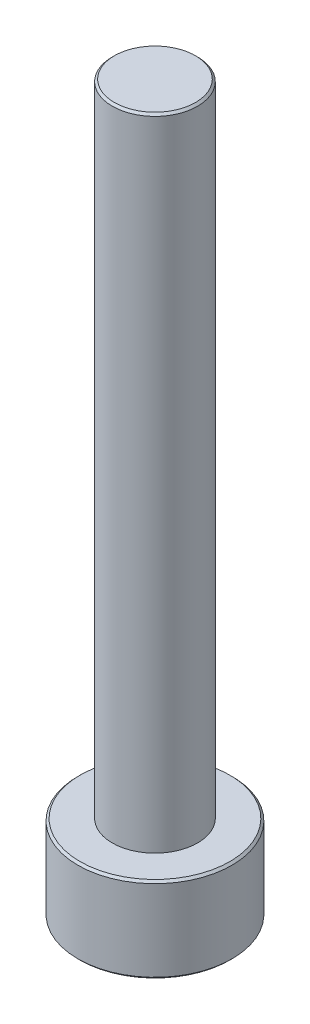
ISO-10303-21;
HEADER;
FILE_DESCRIPTION(('STEP AP214'),'2;1');
FILE_NAME('part.step','',(''),(''),'','','');
FILE_SCHEMA(('AUTOMOTIVE_DESIGN { 1 0 10303 214 1 1 1 1 }'));
ENDSEC;
DATA;
#1=APPLICATION_CONTEXT('core data for automotive mechanical design processes');
#2=APPLICATION_PROTOCOL_DEFINITION('international standard','automotive_design',2000,#1);
#3=PRODUCT_CONTEXT('',#1,'mechanical');
#4=PRODUCT('Part','Part','',(#3));
#5=PRODUCT_RELATED_PRODUCT_CATEGORY('part','',(#4));
#6=PRODUCT_DEFINITION_FORMATION('','',#4);
#7=PRODUCT_DEFINITION_CONTEXT('part definition',#1,'design');
#8=PRODUCT_DEFINITION('design','',#6,#7);
#9=PRODUCT_DEFINITION_SHAPE('','',#8);
#10=(LENGTH_UNIT() NAMED_UNIT(*) SI_UNIT(.MILLI.,.METRE.));
#11=(NAMED_UNIT(*) PLANE_ANGLE_UNIT() SI_UNIT($,.RADIAN.));
#12=(NAMED_UNIT(*) SI_UNIT($,.STERADIAN.) SOLID_ANGLE_UNIT());
#13=UNCERTAINTY_MEASURE_WITH_UNIT(LENGTH_MEASURE(1.E-05),#10,'distance_accuracy_value','');
#14=(GEOMETRIC_REPRESENTATION_CONTEXT(3) GLOBAL_UNCERTAINTY_ASSIGNED_CONTEXT((#13)) GLOBAL_UNIT_ASSIGNED_CONTEXT((#10,
#11,#12)) REPRESENTATION_CONTEXT('',''));
#15=CARTESIAN_POINT('',(0.,0.,0.));
#16=DIRECTION('',(0.,0.,1.));
#17=DIRECTION('',(1.,0.,0.));
#18=AXIS2_PLACEMENT_3D('',#15,#16,#17);
#19=CARTESIAN_POINT('',(0.,4.,0.));
#20=DIRECTION('',(0.,-1.,0.));
#21=DIRECTION('',(0.,0.,-1.));
#22=AXIS2_PLACEMENT_3D('',#19,#20,#21);
#23=CYLINDRICAL_SURFACE('',#22,3.61);
#24=CARTESIAN_POINT('',(0.,3.9,0.));
#25=DIRECTION('',(0.,1.,0.));
#26=DIRECTION('',(0.,0.,1.));
#27=AXIS2_PLACEMENT_3D('',#24,#25,#26);
#28=CIRCLE('',#27,3.61);
#29=CARTESIAN_POINT('',(0.,3.9,3.61));
#30=VERTEX_POINT('',#29);
#31=EDGE_CURVE('E49',#30,#30,#28,.F.);
#32=ORIENTED_EDGE('',*,*,#31,.T.);
#33=EDGE_LOOP('',(#32));
#34=FACE_BOUND('',#33,.T.);
#35=CARTESIAN_POINT('',(0.,0.100000000000005,0.));
#36=DIRECTION('',(0.,1.,0.));
#37=DIRECTION('',(0.,0.,1.));
#38=AXIS2_PLACEMENT_3D('',#35,#36,#37);
#39=CIRCLE('',#38,3.61);
#40=CARTESIAN_POINT('',(0.,0.100000000000005,3.61));
#41=VERTEX_POINT('',#40);
#42=EDGE_CURVE('E160',#41,#41,#39,.T.);
#43=ORIENTED_EDGE('',*,*,#42,.T.);
#44=EDGE_LOOP('',(#43));
#45=FACE_BOUND('',#44,.T.);
#46=ADVANCED_FACE('F41',(#34,#45),#23,.T.);
#47=CARTESIAN_POINT('',(0.,4.,0.));
#48=DIRECTION('',(0.,1.,0.));
#49=DIRECTION('',(0.,0.,1.));
#50=AXIS2_PLACEMENT_3D('',#47,#48,#49);
#51=PLANE('',#50);
#52=CARTESIAN_POINT('',(0.,4.,0.));
#53=DIRECTION('',(0.,1.,0.));
#54=DIRECTION('',(0.,0.,1.));
#55=AXIS2_PLACEMENT_3D('',#52,#53,#54);
#56=CIRCLE('',#55,3.51);
#57=CARTESIAN_POINT('',(0.,4.,3.51));
#58=VERTEX_POINT('',#57);
#59=EDGE_CURVE('E157',#58,#58,#56,.T.);
#60=ORIENTED_EDGE('',*,*,#59,.T.);
#61=EDGE_LOOP('',(#60));
#62=FACE_BOUND('',#61,.T.);
#63=CARTESIAN_POINT('',(0.,4.,0.));
#64=DIRECTION('',(0.,1.,0.));
#65=DIRECTION('',(0.,0.,1.));
#66=AXIS2_PLACEMENT_3D('',#63,#64,#65);
#67=CIRCLE('',#66,2.);
#68=CARTESIAN_POINT('',(0.,4.,2.));
#69=VERTEX_POINT('',#68);
#70=EDGE_CURVE('E143',#69,#69,#67,.T.);
#71=ORIENTED_EDGE('',*,*,#70,.F.);
#72=EDGE_LOOP('',(#71));
#73=FACE_BOUND('',#72,.T.);
#74=ADVANCED_FACE('F173',(#62,#73),#51,.T.);
#75=CARTESIAN_POINT('',(0.,0.,0.));
#76=DIRECTION('',(0.,1.,0.));
#77=DIRECTION('',(0.,0.,1.));
#78=AXIS2_PLACEMENT_3D('',#75,#76,#77);
#79=PLANE('',#78);
#80=CARTESIAN_POINT('',(0.,0.,0.));
#81=DIRECTION('',(0.,1.,0.));
#82=DIRECTION('',(0.,0.,1.));
#83=AXIS2_PLACEMENT_3D('',#80,#81,#82);
#84=CIRCLE('',#83,3.51);
#85=CARTESIAN_POINT('',(0.,0.,3.51));
#86=VERTEX_POINT('',#85);
#87=EDGE_CURVE('E11',#86,#86,#84,.F.);
#88=ORIENTED_EDGE('',*,*,#87,.T.);
#89=EDGE_LOOP('',(#88));
#90=FACE_BOUND('',#89,.T.);
#91=DIRECTION('',(0.,0.,1.));
#92=VECTOR('',#91,1.);
#93=CARTESIAN_POINT('',(1.54,0.,-0.889119414552024));
#94=LINE('',#93,#92);
#95=CARTESIAN_POINT('',(1.54,0.,-0.889119414552024));
#96=VERTEX_POINT('',#95);
#97=CARTESIAN_POINT('',(1.54,0.,0.889119414552024));
#98=VERTEX_POINT('',#97);
#99=EDGE_CURVE('E130',#96,#98,#94,.T.);
#100=ORIENTED_EDGE('',*,*,#99,.F.);
#101=DIRECTION('',(0.866025403784439,0.,0.5));
#102=VECTOR('',#101,1.);
#103=CARTESIAN_POINT('',(0.,0.,-1.77823882910405));
#104=LINE('',#103,#102);
#105=CARTESIAN_POINT('',(0.,0.,-1.77823882910405));
#106=VERTEX_POINT('',#105);
#107=EDGE_CURVE('E56',#106,#96,#104,.T.);
#108=ORIENTED_EDGE('',*,*,#107,.F.);
#109=DIRECTION('',(0.866025403784439,0.,-0.5));
#110=VECTOR('',#109,1.);
#111=CARTESIAN_POINT('',(-1.54,0.,-0.889119414552024));
#112=LINE('',#111,#110);
#113=CARTESIAN_POINT('',(-1.54,0.,-0.889119414552024));
#114=VERTEX_POINT('',#113);
#115=EDGE_CURVE('E139',#114,#106,#112,.T.);
#116=ORIENTED_EDGE('',*,*,#115,.F.);
#117=DIRECTION('',(0.,0.,-1.));
#118=VECTOR('',#117,1.);
#119=CARTESIAN_POINT('',(-1.54,0.,0.889119414552024));
#120=LINE('',#119,#118);
#121=CARTESIAN_POINT('',(-1.54,0.,0.889119414552024));
#122=VERTEX_POINT('',#121);
#123=EDGE_CURVE('E137',#122,#114,#120,.T.);
#124=ORIENTED_EDGE('',*,*,#123,.F.);
#125=DIRECTION('',(-0.866025403784438,0.,-0.5));
#126=VECTOR('',#125,1.);
#127=CARTESIAN_POINT('',(0.,0.,1.77823882910405));
#128=LINE('',#127,#126);
#129=CARTESIAN_POINT('',(0.,0.,1.77823882910405));
#130=VERTEX_POINT('',#129);
#131=EDGE_CURVE('E104',#130,#122,#128,.T.);
#132=ORIENTED_EDGE('',*,*,#131,.F.);
#133=DIRECTION('',(-0.866025403784439,0.,0.5));
#134=VECTOR('',#133,1.);
#135=CARTESIAN_POINT('',(1.54,0.,0.889119414552024));
#136=LINE('',#135,#134);
#137=EDGE_CURVE('E133',#98,#130,#136,.T.);
#138=ORIENTED_EDGE('',*,*,#137,.F.);
#139=EDGE_LOOP('',(#100,#108,#116,#124,#132,#138));
#140=FACE_BOUND('',#139,.T.);
#141=ADVANCED_FACE('F176',(#90,#140),#79,.F.);
#142=CARTESIAN_POINT('',(0.,34.,0.));
#143=DIRECTION('',(0.,-1.,0.));
#144=DIRECTION('',(0.,0.,-1.));
#145=AXIS2_PLACEMENT_3D('',#142,#143,#144);
#146=CYLINDRICAL_SURFACE('',#145,2.);
#147=CARTESIAN_POINT('',(0.,33.9,0.));
#148=DIRECTION('',(0.,1.,0.));
#149=DIRECTION('',(0.,0.,1.));
#150=AXIS2_PLACEMENT_3D('',#147,#148,#149);
#151=CIRCLE('',#150,2.);
#152=CARTESIAN_POINT('',(0.,33.9,2.));
#153=VERTEX_POINT('',#152);
#154=EDGE_CURVE('E154',#153,#153,#151,.F.);
#155=ORIENTED_EDGE('',*,*,#154,.T.);
#156=EDGE_LOOP('',(#155));
#157=FACE_BOUND('',#156,.T.);
#158=ORIENTED_EDGE('',*,*,#70,.T.);
#159=EDGE_LOOP('',(#158));
#160=FACE_BOUND('',#159,.T.);
#161=ADVANCED_FACE('F180',(#157,#160),#146,.T.);
#162=CARTESIAN_POINT('',(0.,34.,0.));
#163=DIRECTION('',(0.,1.,0.));
#164=DIRECTION('',(0.,0.,1.));
#165=AXIS2_PLACEMENT_3D('',#162,#163,#164);
#166=PLANE('',#165);
#167=CARTESIAN_POINT('',(0.,34.,0.));
#168=DIRECTION('',(0.,1.,0.));
#169=DIRECTION('',(0.,0.,1.));
#170=AXIS2_PLACEMENT_3D('',#167,#168,#169);
#171=CIRCLE('',#170,1.9);
#172=CARTESIAN_POINT('',(0.,34.,1.9));
#173=VERTEX_POINT('',#172);
#174=EDGE_CURVE('E151',#173,#173,#171,.T.);
#175=ORIENTED_EDGE('',*,*,#174,.T.);
#176=EDGE_LOOP('',(#175));
#177=FACE_BOUND('',#176,.T.);
#178=ADVANCED_FACE('F182',(#177),#166,.T.);
#179=CARTESIAN_POINT('',(0.,2.,-1.77823882910405));
#180=DIRECTION('',(0.5,0.,-0.866025403784439));
#181=DIRECTION('',(-0.866025403784439,0.,-0.5));
#182=AXIS2_PLACEMENT_3D('',#179,#180,#181);
#183=PLANE('',#182);
#184=ORIENTED_EDGE('',*,*,#107,.T.);
#185=DIRECTION('',(0.,-1.,0.));
#186=VECTOR('',#185,1.);
#187=CARTESIAN_POINT('',(1.54,2.,-0.889119414552024));
#188=LINE('',#187,#186);
#189=CARTESIAN_POINT('',(1.54,2.,-0.889119414552024));
#190=VERTEX_POINT('',#189);
#191=EDGE_CURVE('E86',#190,#96,#188,.T.);
#192=ORIENTED_EDGE('',*,*,#191,.F.);
#193=DIRECTION('',(0.866025403784439,0.,0.5));
#194=VECTOR('',#193,1.);
#195=CARTESIAN_POINT('',(0.,2.,-1.77823882910405));
#196=LINE('',#195,#194);
#197=CARTESIAN_POINT('',(0.,2.,-1.77823882910405));
#198=VERTEX_POINT('',#197);
#199=EDGE_CURVE('E141',#198,#190,#196,.T.);
#200=ORIENTED_EDGE('',*,*,#199,.F.);
#201=DIRECTION('',(0.,-1.,0.));
#202=VECTOR('',#201,1.);
#203=CARTESIAN_POINT('',(0.,2.,-1.77823882910405));
#204=LINE('',#203,#202);
#205=EDGE_CURVE('E64',#198,#106,#204,.T.);
#206=ORIENTED_EDGE('',*,*,#205,.T.);
#207=EDGE_LOOP('',(#184,#192,#200,#206));
#208=FACE_BOUND('',#207,.T.);
#209=ADVANCED_FACE('F189',(#208),#183,.F.);
#210=CARTESIAN_POINT('',(-1.54,2.,-0.889119414552024));
#211=DIRECTION('',(-0.5,0.,-0.866025403784439));
#212=DIRECTION('',(-0.866025403784439,0.,0.5));
#213=AXIS2_PLACEMENT_3D('',#210,#211,#212);
#214=PLANE('',#213);
#215=ORIENTED_EDGE('',*,*,#115,.T.);
#216=ORIENTED_EDGE('',*,*,#205,.F.);
#217=DIRECTION('',(0.866025403784439,0.,-0.5));
#218=VECTOR('',#217,1.);
#219=CARTESIAN_POINT('',(-1.54,2.,-0.889119414552024));
#220=LINE('',#219,#218);
#221=CARTESIAN_POINT('',(-1.54,2.,-0.889119414552024));
#222=VERTEX_POINT('',#221);
#223=EDGE_CURVE('E116',#222,#198,#220,.T.);
#224=ORIENTED_EDGE('',*,*,#223,.F.);
#225=DIRECTION('',(0.,-1.,0.));
#226=VECTOR('',#225,1.);
#227=CARTESIAN_POINT('',(-1.54,2.,-0.889119414552024));
#228=LINE('',#227,#226);
#229=EDGE_CURVE('E108',#222,#114,#228,.T.);
#230=ORIENTED_EDGE('',*,*,#229,.T.);
#231=EDGE_LOOP('',(#215,#216,#224,#230));
#232=FACE_BOUND('',#231,.T.);
#233=ADVANCED_FACE('F216',(#232),#214,.F.);
#234=CARTESIAN_POINT('',(-1.54,2.,0.889119414552024));
#235=DIRECTION('',(-1.,0.,0.));
#236=DIRECTION('',(0.,0.,1.));
#237=AXIS2_PLACEMENT_3D('',#234,#235,#236);
#238=PLANE('',#237);
#239=ORIENTED_EDGE('',*,*,#123,.T.);
#240=ORIENTED_EDGE('',*,*,#229,.F.);
#241=DIRECTION('',(0.,0.,-1.));
#242=VECTOR('',#241,1.);
#243=CARTESIAN_POINT('',(-1.54,2.,0.889119414552024));
#244=LINE('',#243,#242);
#245=CARTESIAN_POINT('',(-1.54,2.,0.889119414552024));
#246=VERTEX_POINT('',#245);
#247=EDGE_CURVE('E112',#246,#222,#244,.T.);
#248=ORIENTED_EDGE('',*,*,#247,.F.);
#249=DIRECTION('',(0.,-1.,0.));
#250=VECTOR('',#249,1.);
#251=CARTESIAN_POINT('',(-1.54,2.,0.889119414552024));
#252=LINE('',#251,#250);
#253=EDGE_CURVE('E97',#246,#122,#252,.T.);
#254=ORIENTED_EDGE('',*,*,#253,.T.);
#255=EDGE_LOOP('',(#239,#240,#248,#254));
#256=FACE_BOUND('',#255,.T.);
#257=ADVANCED_FACE('F113',(#256),#238,.F.);
#258=CARTESIAN_POINT('',(0.,2.,1.77823882910405));
#259=DIRECTION('',(-0.5,0.,0.866025403784439));
#260=DIRECTION('',(0.866025403784438,0.,0.5));
#261=AXIS2_PLACEMENT_3D('',#258,#259,#260);
#262=PLANE('',#261);
#263=ORIENTED_EDGE('',*,*,#131,.T.);
#264=ORIENTED_EDGE('',*,*,#253,.F.);
#265=DIRECTION('',(-0.866025403784438,0.,-0.5));
#266=VECTOR('',#265,1.);
#267=CARTESIAN_POINT('',(0.,2.,1.77823882910405));
#268=LINE('',#267,#266);
#269=CARTESIAN_POINT('',(0.,2.,1.77823882910405));
#270=VERTEX_POINT('',#269);
#271=EDGE_CURVE('E101',#270,#246,#268,.T.);
#272=ORIENTED_EDGE('',*,*,#271,.F.);
#273=DIRECTION('',(0.,-1.,0.));
#274=VECTOR('',#273,1.);
#275=CARTESIAN_POINT('',(0.,2.,1.77823882910405));
#276=LINE('',#275,#274);
#277=EDGE_CURVE('E109',#270,#130,#276,.T.);
#278=ORIENTED_EDGE('',*,*,#277,.T.);
#279=EDGE_LOOP('',(#263,#264,#272,#278));
#280=FACE_BOUND('',#279,.T.);
#281=ADVANCED_FACE('F99',(#280),#262,.F.);
#282=CARTESIAN_POINT('',(1.54,2.,0.889119414552024));
#283=DIRECTION('',(0.5,0.,0.866025403784439));
#284=DIRECTION('',(0.866025403784439,0.,-0.5));
#285=AXIS2_PLACEMENT_3D('',#282,#283,#284);
#286=PLANE('',#285);
#287=ORIENTED_EDGE('',*,*,#137,.T.);
#288=ORIENTED_EDGE('',*,*,#277,.F.);
#289=DIRECTION('',(-0.866025403784439,0.,0.5));
#290=VECTOR('',#289,1.);
#291=CARTESIAN_POINT('',(1.54,2.,0.889119414552024));
#292=LINE('',#291,#290);
#293=CARTESIAN_POINT('',(1.54,2.,0.889119414552024));
#294=VERTEX_POINT('',#293);
#295=EDGE_CURVE('E122',#294,#270,#292,.T.);
#296=ORIENTED_EDGE('',*,*,#295,.F.);
#297=DIRECTION('',(0.,-1.,0.));
#298=VECTOR('',#297,1.);
#299=CARTESIAN_POINT('',(1.54,2.,0.889119414552024));
#300=LINE('',#299,#298);
#301=EDGE_CURVE('E146',#294,#98,#300,.T.);
#302=ORIENTED_EDGE('',*,*,#301,.T.);
#303=EDGE_LOOP('',(#287,#288,#296,#302));
#304=FACE_BOUND('',#303,.T.);
#305=ADVANCED_FACE('F212',(#304),#286,.F.);
#306=CARTESIAN_POINT('',(1.54,2.,-0.889119414552024));
#307=DIRECTION('',(1.,0.,0.));
#308=DIRECTION('',(0.,0.,-1.));
#309=AXIS2_PLACEMENT_3D('',#306,#307,#308);
#310=PLANE('',#309);
#311=ORIENTED_EDGE('',*,*,#99,.T.);
#312=ORIENTED_EDGE('',*,*,#301,.F.);
#313=DIRECTION('',(0.,0.,1.));
#314=VECTOR('',#313,1.);
#315=CARTESIAN_POINT('',(1.54,2.,-0.889119414552024));
#316=LINE('',#315,#314);
#317=EDGE_CURVE('E124',#190,#294,#316,.T.);
#318=ORIENTED_EDGE('',*,*,#317,.F.);
#319=ORIENTED_EDGE('',*,*,#191,.T.);
#320=EDGE_LOOP('',(#311,#312,#318,#319));
#321=FACE_BOUND('',#320,.T.);
#322=ADVANCED_FACE('F204',(#321),#310,.F.);
#323=CARTESIAN_POINT('',(0.,2.,0.));
#324=DIRECTION('',(0.,-1.,0.));
#325=DIRECTION('',(0.,0.,-1.));
#326=AXIS2_PLACEMENT_3D('',#323,#324,#325);
#327=PLANE('',#326);
#328=ORIENTED_EDGE('',*,*,#199,.T.);
#329=ORIENTED_EDGE('',*,*,#317,.T.);
#330=ORIENTED_EDGE('',*,*,#295,.T.);
#331=ORIENTED_EDGE('',*,*,#271,.T.);
#332=ORIENTED_EDGE('',*,*,#247,.T.);
#333=ORIENTED_EDGE('',*,*,#223,.T.);
#334=EDGE_LOOP('',(#328,#329,#330,#331,#332,#333));
#335=FACE_BOUND('',#334,.T.);
#336=ADVANCED_FACE('F119',(#335),#327,.T.);
#337=CARTESIAN_POINT('',(0.,34.,0.));
#338=DIRECTION('',(0.,-1.,0.));
#339=DIRECTION('',(0.,0.,-1.));
#340=AXIS2_PLACEMENT_3D('',#337,#338,#339);
#341=CONICAL_SURFACE('',#340,1.9,0.785398163397457);
#342=ORIENTED_EDGE('',*,*,#154,.F.);
#343=EDGE_LOOP('',(#342));
#344=FACE_BOUND('',#343,.T.);
#345=ORIENTED_EDGE('',*,*,#174,.F.);
#346=EDGE_LOOP('',(#345));
#347=FACE_BOUND('',#346,.T.);
#348=ADVANCED_FACE('F170',(#344,#347),#341,.T.);
#349=CARTESIAN_POINT('',(0.,4.,0.));
#350=DIRECTION('',(0.,-1.,0.));
#351=DIRECTION('',(0.,0.,-1.));
#352=AXIS2_PLACEMENT_3D('',#349,#350,#351);
#353=CONICAL_SURFACE('',#352,3.51,0.78539816339744);
#354=ORIENTED_EDGE('',*,*,#31,.F.);
#355=EDGE_LOOP('',(#354));
#356=FACE_BOUND('',#355,.T.);
#357=ORIENTED_EDGE('',*,*,#59,.F.);
#358=EDGE_LOOP('',(#357));
#359=FACE_BOUND('',#358,.T.);
#360=ADVANCED_FACE('F167',(#356,#359),#353,.T.);
#361=CARTESIAN_POINT('',(0.,0.100000000000005,0.));
#362=DIRECTION('',(0.,1.,0.));
#363=DIRECTION('',(0.,0.,1.));
#364=AXIS2_PLACEMENT_3D('',#361,#362,#363);
#365=CONICAL_SURFACE('',#364,3.61,0.785398163397442);
#366=CARTESIAN_POINT('',(0.,0.,3.51));
#367=CARTESIAN_POINT('',(0.,0.00104166666666671,3.51104166666666));
#368=CARTESIAN_POINT('',(0.,0.00208333333333343,3.51208333333333));
#369=CARTESIAN_POINT('',(0.,0.00416666666666688,3.51416666666666));
#370=CARTESIAN_POINT('',(0.,0.00520833333333361,3.51520833333333));
#371=CARTESIAN_POINT('',(0.,0.00729166666666705,3.51729166666666));
#372=CARTESIAN_POINT('',(0.,0.00833333333333377,3.51833333333333));
#373=CARTESIAN_POINT('',(0.,0.0104166666666672,3.52041666666666));
#374=CARTESIAN_POINT('',(0.,0.011458333333334,3.52145833333333));
#375=CARTESIAN_POINT('',(0.,0.0135416666666674,3.52354166666666));
#376=CARTESIAN_POINT('',(0.,0.0145833333333341,3.52458333333333));
#377=CARTESIAN_POINT('',(0.,0.0166666666666676,3.52666666666666));
#378=CARTESIAN_POINT('',(0.,0.0177083333333343,3.52770833333333));
#379=CARTESIAN_POINT('',(0.,0.0197916666666678,3.52979166666666));
#380=CARTESIAN_POINT('',(0.,0.0208333333333344,3.53083333333333));
#381=CARTESIAN_POINT('',(0.,0.0229166666666679,3.53291666666666));
#382=CARTESIAN_POINT('',(0.,0.0239583333333346,3.53395833333333));
#383=CARTESIAN_POINT('',(0.,0.0260416666666681,3.53604166666666));
#384=CARTESIAN_POINT('',(0.,0.0270833333333348,3.53708333333333));
#385=CARTESIAN_POINT('',(0.,0.0291666666666682,3.53916666666666));
#386=CARTESIAN_POINT('',(0.,0.030208333333335,3.54020833333333));
#387=CARTESIAN_POINT('',(0.,0.0322916666666684,3.54229166666666));
#388=CARTESIAN_POINT('',(0.,0.0333333333333351,3.54333333333333));
#389=CARTESIAN_POINT('',(0.,0.0354166666666686,3.54541666666666));
#390=CARTESIAN_POINT('',(0.,0.0364583333333353,3.54645833333333));
#391=CARTESIAN_POINT('',(0.,0.0385416666666688,3.54854166666666));
#392=CARTESIAN_POINT('',(0.,0.0395833333333355,3.54958333333333));
#393=CARTESIAN_POINT('',(0.,0.0416666666666689,3.55166666666666));
#394=CARTESIAN_POINT('',(0.,0.0427083333333357,3.55270833333333));
#395=CARTESIAN_POINT('',(0.,0.0447916666666691,3.55479166666666));
#396=CARTESIAN_POINT('',(0.,0.0458333333333358,3.55583333333333));
#397=CARTESIAN_POINT('',(0.,0.0479166666666693,3.55791666666666));
#398=CARTESIAN_POINT('',(0.,0.048958333333336,3.55895833333333));
#399=CARTESIAN_POINT('',(0.,0.0510416666666695,3.56104166666666));
#400=CARTESIAN_POINT('',(0.,0.0520833333333361,3.56208333333333));
#401=CARTESIAN_POINT('',(0.,0.0541666666666696,3.56416666666666));
#402=CARTESIAN_POINT('',(0.,0.0552083333333363,3.56520833333333));
#403=CARTESIAN_POINT('',(0.,0.0572916666666698,3.56729166666666));
#404=CARTESIAN_POINT('',(0.,0.0583333333333365,3.56833333333333));
#405=CARTESIAN_POINT('',(0.,0.06041666666667,3.57041666666666));
#406=CARTESIAN_POINT('',(0.,0.0614583333333367,3.57145833333333));
#407=CARTESIAN_POINT('',(0.,0.0635416666666701,3.57354166666667));
#408=CARTESIAN_POINT('',(0.,0.0645833333333369,3.57458333333333));
#409=CARTESIAN_POINT('',(0.,0.0666666666666703,3.57666666666666));
#410=CARTESIAN_POINT('',(0.,0.067708333333337,3.57770833333333));
#411=CARTESIAN_POINT('',(0.,0.0697916666666705,3.57979166666667));
#412=CARTESIAN_POINT('',(0.,0.0708333333333372,3.58083333333333));
#413=CARTESIAN_POINT('',(0.,0.0729166666666706,3.58291666666667));
#414=CARTESIAN_POINT('',(0.,0.0739583333333374,3.58395833333333));
#415=CARTESIAN_POINT('',(0.,0.0760416666666708,3.58604166666667));
#416=CARTESIAN_POINT('',(0.,0.0770833333333375,3.58708333333333));
#417=CARTESIAN_POINT('',(0.,0.079166666666671,3.58916666666667));
#418=CARTESIAN_POINT('',(0.,0.0802083333333378,3.59020833333333));
#419=CARTESIAN_POINT('',(0.,0.0822916666666712,3.59229166666667));
#420=CARTESIAN_POINT('',(0.,0.0833333333333379,3.59333333333333));
#421=CARTESIAN_POINT('',(0.,0.0854166666666713,3.59541666666667));
#422=CARTESIAN_POINT('',(0.,0.086458333333338,3.59645833333333));
#423=CARTESIAN_POINT('',(0.,0.0885416666666715,3.59854166666667));
#424=CARTESIAN_POINT('',(0.,0.0895833333333382,3.59958333333333));
#425=CARTESIAN_POINT('',(0.,0.0916666666666717,3.60166666666667));
#426=CARTESIAN_POINT('',(0.,0.0927083333333384,3.60270833333333));
#427=CARTESIAN_POINT('',(0.,0.0947916666666719,3.60479166666667));
#428=CARTESIAN_POINT('',(0.,0.0958333333333386,3.60583333333333));
#429=CARTESIAN_POINT('',(0.,0.097916666666672,3.60791666666667));
#430=CARTESIAN_POINT('',(0.,0.0989583333333387,3.60895833333333));
#431=CARTESIAN_POINT('',(0.,0.100000000000005,3.61));
#432=B_SPLINE_CURVE_WITH_KNOTS('',3,(#366,#367,#368,#369,#370,#371,#372,#373,#374,#375,#376,
#377,#378,#379,#380,#381,#382,#383,#384,#385,#386,#387,#388,#389,#390,#391,#392,#393,#394,#395,
#396,#397,#398,#399,#400,#401,#402,#403,#404,#405,#406,#407,#408,#409,#410,#411,#412,#413,#414,
#415,#416,#417,#418,#419,#420,#421,#422,#423,#424,#425,#426,#427,#428,#429,#430,#431),
.UNSPECIFIED.,.F.,.F.,(4,2,2,2,2,2,2,2,2,2,2,2,2,2,2,2,2,2,2,2,2,2,2,2,2,2,2,2,2,2,2,2,4),(0.,
0.00441941738241611,0.00883883476483221,0.0132582521472483,0.0176776695296644,
0.0220970869120805,0.0265165042944966,0.030935921676913,0.0353553390593291,0.0397747564417453,
0.0441941738241614,0.0486135912065775,0.0530330085889936,0.0574524259714097,0.0618718433538258,
0.0662912607362419,0.070710678118658,0.0751300955010744,0.0795495128834905,0.0839689302659066,
0.0883883476483227,0.0928077650307388,0.097227182413155,0.101646599795571,0.106066017177987,
0.110485434560403,0.114904851942819,0.119324269325236,0.123743686707652,0.128163104090068,
0.132582521472484,0.1370019388549,0.141421356237316),.UNSPECIFIED.);
#433=EDGE_CURVE('BSEAM43',#86,#41,#432,.T.);
#434=ORIENTED_EDGE('',*,*,#87,.F.);
#435=ORIENTED_EDGE('',*,*,#42,.F.);
#436=ORIENTED_EDGE('',*,*,#433,.T.);
#437=ORIENTED_EDGE('',*,*,#433,.F.);
#438=EDGE_LOOP('',(#434,#436,#435,#437));
#439=FACE_BOUND('',#438,.T.);
#440=ADVANCED_FACE('F43',(#439),#365,.T.);
#441=CLOSED_SHELL('',(#46,#74,#141,#161,#178,#209,#233,#257,#281,#305,#322,#336,#348,#360,#440));
#442=MANIFOLD_SOLID_BREP('B2',#441);
#443=ADVANCED_BREP_SHAPE_REPRESENTATION('',(#18,#442),#14);
#444=SHAPE_DEFINITION_REPRESENTATION(#9,#443);
ENDSEC;
END-ISO-10303-21;
